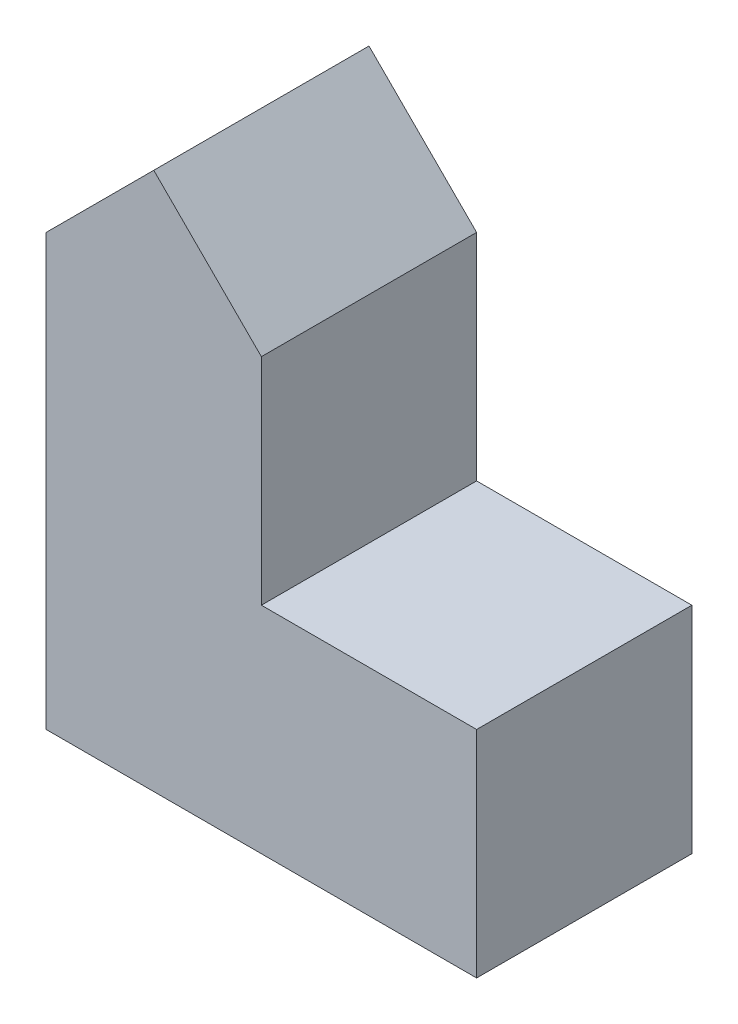
ISO-10303-21;
HEADER;
FILE_DESCRIPTION(('STEP AP214'),'2;1');
FILE_NAME('part.step','',(''),(''),'','','');
FILE_SCHEMA(('AUTOMOTIVE_DESIGN { 1 0 10303 214 1 1 1 1 }'));
ENDSEC;
DATA;
#1=APPLICATION_CONTEXT('core data for automotive mechanical design processes');
#2=APPLICATION_PROTOCOL_DEFINITION('international standard','automotive_design',2000,#1);
#3=PRODUCT_CONTEXT('',#1,'mechanical');
#4=PRODUCT('Part','Part','',(#3));
#5=PRODUCT_RELATED_PRODUCT_CATEGORY('part','',(#4));
#6=PRODUCT_DEFINITION_FORMATION('','',#4);
#7=PRODUCT_DEFINITION_CONTEXT('part definition',#1,'design');
#8=PRODUCT_DEFINITION('design','',#6,#7);
#9=PRODUCT_DEFINITION_SHAPE('','',#8);
#10=(LENGTH_UNIT() NAMED_UNIT(*) SI_UNIT(.MILLI.,.METRE.));
#11=(NAMED_UNIT(*) PLANE_ANGLE_UNIT() SI_UNIT($,.RADIAN.));
#12=(NAMED_UNIT(*) SI_UNIT($,.STERADIAN.) SOLID_ANGLE_UNIT());
#13=UNCERTAINTY_MEASURE_WITH_UNIT(LENGTH_MEASURE(1.E-05),#10,'distance_accuracy_value','');
#14=(GEOMETRIC_REPRESENTATION_CONTEXT(3) GLOBAL_UNCERTAINTY_ASSIGNED_CONTEXT((#13)) GLOBAL_UNIT_ASSIGNED_CONTEXT((#10,
#11,#12)) REPRESENTATION_CONTEXT('',''));
#15=CARTESIAN_POINT('',(0.,0.,0.));
#16=DIRECTION('',(0.,0.,1.));
#17=DIRECTION('',(1.,0.,0.));
#18=AXIS2_PLACEMENT_3D('',#15,#16,#17);
#19=CARTESIAN_POINT('',(0.,20.,10.));
#20=DIRECTION('',(1.,0.,0.));
#21=DIRECTION('',(0.,1.,0.));
#22=AXIS2_PLACEMENT_3D('',#19,#20,#21);
#23=PLANE('',#22);
#24=DIRECTION('',(0.,-1.,0.));
#25=VECTOR('',#24,1.);
#26=CARTESIAN_POINT('',(0.,20.,0.));
#27=LINE('',#26,#25);
#28=CARTESIAN_POINT('',(0.,20.,0.));
#29=VERTEX_POINT('',#28);
#30=CARTESIAN_POINT('',(0.,0.,0.));
#31=VERTEX_POINT('',#30);
#32=EDGE_CURVE('E124',#29,#31,#27,.T.);
#33=ORIENTED_EDGE('',*,*,#32,.T.);
#34=DIRECTION('',(0.,0.,-1.));
#35=VECTOR('',#34,1.);
#36=CARTESIAN_POINT('',(0.,0.,10.));
#37=LINE('',#36,#35);
#38=CARTESIAN_POINT('',(0.,0.,10.));
#39=VERTEX_POINT('',#38);
#40=EDGE_CURVE('E11',#39,#31,#37,.T.);
#41=ORIENTED_EDGE('',*,*,#40,.F.);
#42=DIRECTION('',(0.,-1.,0.));
#43=VECTOR('',#42,1.);
#44=CARTESIAN_POINT('',(0.,20.,10.));
#45=LINE('',#44,#43);
#46=CARTESIAN_POINT('',(0.,20.,10.));
#47=VERTEX_POINT('',#46);
#48=EDGE_CURVE('E136',#47,#39,#45,.T.);
#49=ORIENTED_EDGE('',*,*,#48,.F.);
#50=DIRECTION('',(0.,0.,-1.));
#51=VECTOR('',#50,1.);
#52=CARTESIAN_POINT('',(0.,20.,10.));
#53=LINE('',#52,#51);
#54=EDGE_CURVE('E120',#47,#29,#53,.T.);
#55=ORIENTED_EDGE('',*,*,#54,.T.);
#56=EDGE_LOOP('',(#33,#41,#49,#55));
#57=FACE_BOUND('',#56,.T.);
#58=ADVANCED_FACE('F34',(#57),#23,.F.);
#59=CARTESIAN_POINT('',(0.,0.,10.));
#60=DIRECTION('',(0.,1.,0.));
#61=DIRECTION('',(0.,0.,1.));
#62=AXIS2_PLACEMENT_3D('',#59,#60,#61);
#63=PLANE('',#62);
#64=DIRECTION('',(1.,0.,0.));
#65=VECTOR('',#64,1.);
#66=CARTESIAN_POINT('',(0.,0.,0.));
#67=LINE('',#66,#65);
#68=CARTESIAN_POINT('',(20.,0.,0.));
#69=VERTEX_POINT('',#68);
#70=EDGE_CURVE('E127',#31,#69,#67,.T.);
#71=ORIENTED_EDGE('',*,*,#70,.T.);
#72=DIRECTION('',(0.,0.,-1.));
#73=VECTOR('',#72,1.);
#74=CARTESIAN_POINT('',(20.,0.,10.));
#75=LINE('',#74,#73);
#76=CARTESIAN_POINT('',(20.,0.,10.));
#77=VERTEX_POINT('',#76);
#78=EDGE_CURVE('E42',#77,#69,#75,.T.);
#79=ORIENTED_EDGE('',*,*,#78,.F.);
#80=DIRECTION('',(1.,0.,0.));
#81=VECTOR('',#80,1.);
#82=CARTESIAN_POINT('',(0.,0.,10.));
#83=LINE('',#82,#81);
#84=EDGE_CURVE('E90',#39,#77,#83,.T.);
#85=ORIENTED_EDGE('',*,*,#84,.F.);
#86=ORIENTED_EDGE('',*,*,#40,.T.);
#87=EDGE_LOOP('',(#71,#79,#85,#86));
#88=FACE_BOUND('',#87,.T.);
#89=ADVANCED_FACE('F161',(#88),#63,.F.);
#90=CARTESIAN_POINT('',(20.,0.,10.));
#91=DIRECTION('',(-1.,0.,0.));
#92=DIRECTION('',(0.,0.,1.));
#93=AXIS2_PLACEMENT_3D('',#90,#91,#92);
#94=PLANE('',#93);
#95=DIRECTION('',(0.,1.,0.));
#96=VECTOR('',#95,1.);
#97=CARTESIAN_POINT('',(20.,0.,0.));
#98=LINE('',#97,#96);
#99=CARTESIAN_POINT('',(20.,10.,0.));
#100=VERTEX_POINT('',#99);
#101=EDGE_CURVE('E129',#69,#100,#98,.T.);
#102=ORIENTED_EDGE('',*,*,#101,.T.);
#103=DIRECTION('',(0.,0.,-1.));
#104=VECTOR('',#103,1.);
#105=CARTESIAN_POINT('',(20.,10.,10.));
#106=LINE('',#105,#104);
#107=CARTESIAN_POINT('',(20.,10.,10.));
#108=VERTEX_POINT('',#107);
#109=EDGE_CURVE('E140',#108,#100,#106,.T.);
#110=ORIENTED_EDGE('',*,*,#109,.F.);
#111=DIRECTION('',(0.,1.,0.));
#112=VECTOR('',#111,1.);
#113=CARTESIAN_POINT('',(20.,0.,10.));
#114=LINE('',#113,#112);
#115=EDGE_CURVE('E148',#77,#108,#114,.T.);
#116=ORIENTED_EDGE('',*,*,#115,.F.);
#117=ORIENTED_EDGE('',*,*,#78,.T.);
#118=EDGE_LOOP('',(#102,#110,#116,#117));
#119=FACE_BOUND('',#118,.T.);
#120=ADVANCED_FACE('F146',(#119),#94,.F.);
#121=CARTESIAN_POINT('',(20.,10.,10.));
#122=DIRECTION('',(0.,-1.,0.));
#123=DIRECTION('',(1.,0.,0.));
#124=AXIS2_PLACEMENT_3D('',#121,#122,#123);
#125=PLANE('',#124);
#126=DIRECTION('',(-1.,0.,0.));
#127=VECTOR('',#126,1.);
#128=CARTESIAN_POINT('',(20.,10.,0.));
#129=LINE('',#128,#127);
#130=CARTESIAN_POINT('',(10.,10.,0.));
#131=VERTEX_POINT('',#130);
#132=EDGE_CURVE('E131',#100,#131,#129,.T.);
#133=ORIENTED_EDGE('',*,*,#132,.T.);
#134=DIRECTION('',(0.,0.,-1.));
#135=VECTOR('',#134,1.);
#136=CARTESIAN_POINT('',(10.,10.,10.));
#137=LINE('',#136,#135);
#138=CARTESIAN_POINT('',(10.,10.,10.));
#139=VERTEX_POINT('',#138);
#140=EDGE_CURVE('E115',#139,#131,#137,.T.);
#141=ORIENTED_EDGE('',*,*,#140,.F.);
#142=DIRECTION('',(-1.,0.,0.));
#143=VECTOR('',#142,1.);
#144=CARTESIAN_POINT('',(20.,10.,10.));
#145=LINE('',#144,#143);
#146=EDGE_CURVE('E106',#108,#139,#145,.T.);
#147=ORIENTED_EDGE('',*,*,#146,.F.);
#148=ORIENTED_EDGE('',*,*,#109,.T.);
#149=EDGE_LOOP('',(#133,#141,#147,#148));
#150=FACE_BOUND('',#149,.T.);
#151=ADVANCED_FACE('F154',(#150),#125,.F.);
#152=CARTESIAN_POINT('',(10.,10.,10.));
#153=DIRECTION('',(-1.,0.,0.));
#154=DIRECTION('',(0.,0.,1.));
#155=AXIS2_PLACEMENT_3D('',#152,#153,#154);
#156=PLANE('',#155);
#157=DIRECTION('',(0.,1.,0.));
#158=VECTOR('',#157,1.);
#159=CARTESIAN_POINT('',(10.,10.,0.));
#160=LINE('',#159,#158);
#161=CARTESIAN_POINT('',(10.,20.,0.));
#162=VERTEX_POINT('',#161);
#163=EDGE_CURVE('E114',#131,#162,#160,.T.);
#164=ORIENTED_EDGE('',*,*,#163,.T.);
#165=DIRECTION('',(0.,0.,-1.));
#166=VECTOR('',#165,1.);
#167=CARTESIAN_POINT('',(10.,20.,10.));
#168=LINE('',#167,#166);
#169=CARTESIAN_POINT('',(10.,20.,10.));
#170=VERTEX_POINT('',#169);
#171=EDGE_CURVE('E111',#170,#162,#168,.T.);
#172=ORIENTED_EDGE('',*,*,#171,.F.);
#173=DIRECTION('',(0.,1.,0.));
#174=VECTOR('',#173,1.);
#175=CARTESIAN_POINT('',(10.,10.,10.));
#176=LINE('',#175,#174);
#177=EDGE_CURVE('E100',#139,#170,#176,.T.);
#178=ORIENTED_EDGE('',*,*,#177,.F.);
#179=ORIENTED_EDGE('',*,*,#140,.T.);
#180=EDGE_LOOP('',(#164,#172,#178,#179));
#181=FACE_BOUND('',#180,.T.);
#182=ADVANCED_FACE('F112',(#181),#156,.F.);
#183=CARTESIAN_POINT('',(10.,20.,10.));
#184=DIRECTION('',(-0.707106781186549,-0.707106781186546,0.));
#185=DIRECTION('',(0.707106781186546,-0.707106781186549,0.));
#186=AXIS2_PLACEMENT_3D('',#183,#184,#185);
#187=PLANE('',#186);
#188=DIRECTION('',(-0.707106781186546,0.707106781186549,0.));
#189=VECTOR('',#188,1.);
#190=CARTESIAN_POINT('',(10.,20.,0.));
#191=LINE('',#190,#189);
#192=CARTESIAN_POINT('',(5.,25.,0.));
#193=VERTEX_POINT('',#192);
#194=EDGE_CURVE('E76',#162,#193,#191,.T.);
#195=ORIENTED_EDGE('',*,*,#194,.T.);
#196=DIRECTION('',(0.,0.,-1.));
#197=VECTOR('',#196,1.);
#198=CARTESIAN_POINT('',(5.,25.,10.));
#199=LINE('',#198,#197);
#200=CARTESIAN_POINT('',(5.,25.,10.));
#201=VERTEX_POINT('',#200);
#202=EDGE_CURVE('E116',#201,#193,#199,.T.);
#203=ORIENTED_EDGE('',*,*,#202,.F.);
#204=DIRECTION('',(-0.707106781186546,0.707106781186549,0.));
#205=VECTOR('',#204,1.);
#206=CARTESIAN_POINT('',(10.,20.,10.));
#207=LINE('',#206,#205);
#208=EDGE_CURVE('E104',#170,#201,#207,.T.);
#209=ORIENTED_EDGE('',*,*,#208,.F.);
#210=ORIENTED_EDGE('',*,*,#171,.T.);
#211=EDGE_LOOP('',(#195,#203,#209,#210));
#212=FACE_BOUND('',#211,.T.);
#213=ADVANCED_FACE('F118',(#212),#187,.F.);
#214=CARTESIAN_POINT('',(5.,25.,10.));
#215=DIRECTION('',(0.707106781186549,-0.707106781186546,0.));
#216=DIRECTION('',(0.707106781186546,0.707106781186549,0.));
#217=AXIS2_PLACEMENT_3D('',#214,#215,#216);
#218=PLANE('',#217);
#219=DIRECTION('',(-0.707106781186546,-0.707106781186549,0.));
#220=VECTOR('',#219,1.);
#221=CARTESIAN_POINT('',(5.,25.,0.));
#222=LINE('',#221,#220);
#223=EDGE_CURVE('E82',#193,#29,#222,.T.);
#224=ORIENTED_EDGE('',*,*,#223,.T.);
#225=ORIENTED_EDGE('',*,*,#54,.F.);
#226=DIRECTION('',(-0.707106781186546,-0.707106781186549,0.));
#227=VECTOR('',#226,1.);
#228=CARTESIAN_POINT('',(5.,25.,10.));
#229=LINE('',#228,#227);
#230=EDGE_CURVE('E50',#201,#47,#229,.T.);
#231=ORIENTED_EDGE('',*,*,#230,.F.);
#232=ORIENTED_EDGE('',*,*,#202,.T.);
#233=EDGE_LOOP('',(#224,#225,#231,#232));
#234=FACE_BOUND('',#233,.T.);
#235=ADVANCED_FACE('F175',(#234),#218,.F.);
#236=CARTESIAN_POINT('',(0.,0.,10.));
#237=DIRECTION('',(0.,0.,1.));
#238=DIRECTION('',(1.,0.,0.));
#239=AXIS2_PLACEMENT_3D('',#236,#237,#238);
#240=PLANE('',#239);
#241=ORIENTED_EDGE('',*,*,#48,.T.);
#242=ORIENTED_EDGE('',*,*,#84,.T.);
#243=ORIENTED_EDGE('',*,*,#115,.T.);
#244=ORIENTED_EDGE('',*,*,#146,.T.);
#245=ORIENTED_EDGE('',*,*,#177,.T.);
#246=ORIENTED_EDGE('',*,*,#208,.T.);
#247=ORIENTED_EDGE('',*,*,#230,.T.);
#248=EDGE_LOOP('',(#241,#242,#243,#244,#245,#246,#247));
#249=FACE_BOUND('',#248,.T.);
#250=ADVANCED_FACE('F102',(#249),#240,.T.);
#251=CARTESIAN_POINT('',(0.,0.,0.));
#252=DIRECTION('',(0.,0.,1.));
#253=DIRECTION('',(1.,0.,0.));
#254=AXIS2_PLACEMENT_3D('',#251,#252,#253);
#255=PLANE('',#254);
#256=ORIENTED_EDGE('',*,*,#32,.F.);
#257=ORIENTED_EDGE('',*,*,#223,.F.);
#258=ORIENTED_EDGE('',*,*,#194,.F.);
#259=ORIENTED_EDGE('',*,*,#163,.F.);
#260=ORIENTED_EDGE('',*,*,#132,.F.);
#261=ORIENTED_EDGE('',*,*,#101,.F.);
#262=ORIENTED_EDGE('',*,*,#70,.F.);
#263=EDGE_LOOP('',(#256,#257,#258,#259,#260,#261,#262));
#264=FACE_BOUND('',#263,.T.);
#265=ADVANCED_FACE('F152',(#264),#255,.F.);
#266=CLOSED_SHELL('',(#58,#89,#120,#151,#182,#213,#235,#250,#265));
#267=MANIFOLD_SOLID_BREP('B2',#266);
#268=ADVANCED_BREP_SHAPE_REPRESENTATION('',(#18,#267),#14);
#269=SHAPE_DEFINITION_REPRESENTATION(#9,#268);
ENDSEC;
END-ISO-10303-21;
